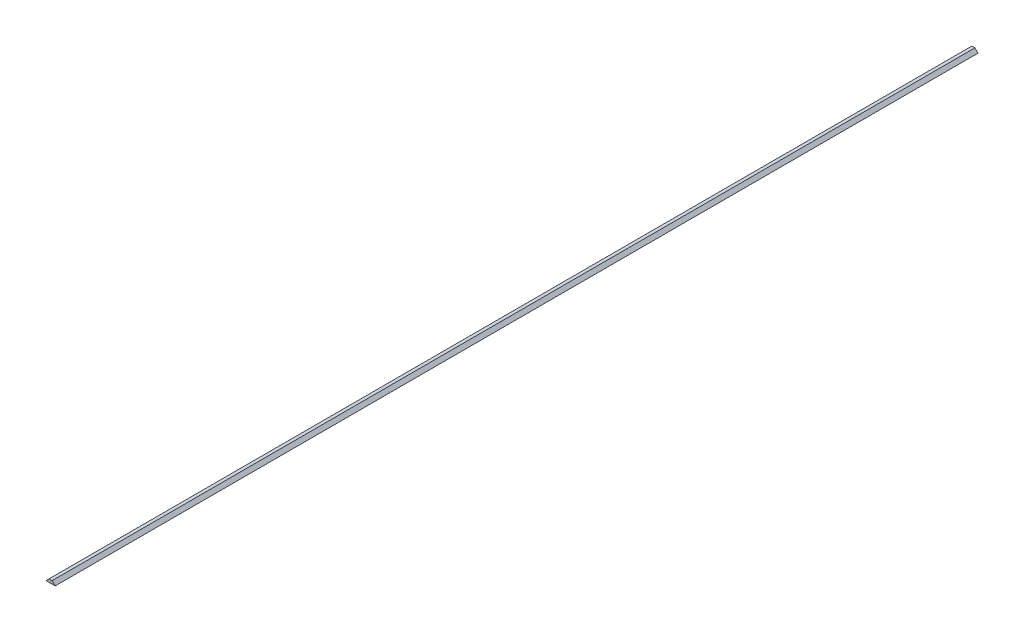
ISO-10303-21;
HEADER;
FILE_DESCRIPTION(('STEP AP214'),'2;1');
FILE_NAME('part.step','',(''),(''),'','','');
FILE_SCHEMA(('AUTOMOTIVE_DESIGN { 1 0 10303 214 1 1 1 1 }'));
ENDSEC;
DATA;
#1=APPLICATION_CONTEXT('core data for automotive mechanical design processes');
#2=APPLICATION_PROTOCOL_DEFINITION('international standard','automotive_design',2000,#1);
#3=PRODUCT_CONTEXT('',#1,'mechanical');
#4=PRODUCT('Part','Part','',(#3));
#5=PRODUCT_RELATED_PRODUCT_CATEGORY('part','',(#4));
#6=PRODUCT_DEFINITION_FORMATION('','',#4);
#7=PRODUCT_DEFINITION_CONTEXT('part definition',#1,'design');
#8=PRODUCT_DEFINITION('design','',#6,#7);
#9=PRODUCT_DEFINITION_SHAPE('','',#8);
#10=(LENGTH_UNIT() NAMED_UNIT(*) SI_UNIT(.MILLI.,.METRE.));
#11=(NAMED_UNIT(*) PLANE_ANGLE_UNIT() SI_UNIT($,.RADIAN.));
#12=(NAMED_UNIT(*) SI_UNIT($,.STERADIAN.) SOLID_ANGLE_UNIT());
#13=UNCERTAINTY_MEASURE_WITH_UNIT(LENGTH_MEASURE(1.E-05),#10,'distance_accuracy_value','');
#14=(GEOMETRIC_REPRESENTATION_CONTEXT(3) GLOBAL_UNCERTAINTY_ASSIGNED_CONTEXT((#13)) GLOBAL_UNIT_ASSIGNED_CONTEXT((#10,
#11,#12)) REPRESENTATION_CONTEXT('',''));
#15=CARTESIAN_POINT('',(0.,0.,0.));
#16=DIRECTION('',(0.,0.,1.));
#17=DIRECTION('',(1.,0.,0.));
#18=AXIS2_PLACEMENT_3D('',#15,#16,#17);
#19=CARTESIAN_POINT('',(5.,10.,3000.));
#20=DIRECTION('',(0.,-1.,0.));
#21=DIRECTION('',(0.,0.,-1.));
#22=AXIS2_PLACEMENT_3D('',#19,#20,#21);
#23=PLANE('',#22);
#24=DIRECTION('',(-1.,0.,0.));
#25=VECTOR('',#24,1.);
#26=CARTESIAN_POINT('',(5.,10.,0.));
#27=LINE('',#26,#25);
#28=CARTESIAN_POINT('',(5.,10.,0.));
#29=VERTEX_POINT('',#28);
#30=CARTESIAN_POINT('',(-5.,10.,0.));
#31=VERTEX_POINT('',#30);
#32=EDGE_CURVE('E97',#29,#31,#27,.T.);
#33=ORIENTED_EDGE('',*,*,#32,.T.);
#34=DIRECTION('',(0.,0.,-1.));
#35=VECTOR('',#34,1.);
#36=CARTESIAN_POINT('',(-5.,10.,3000.));
#37=LINE('',#36,#35);
#38=CARTESIAN_POINT('',(-5.,10.,3000.));
#39=VERTEX_POINT('',#38);
#40=EDGE_CURVE('E11',#39,#31,#37,.T.);
#41=ORIENTED_EDGE('',*,*,#40,.F.);
#42=DIRECTION('',(-1.,0.,0.));
#43=VECTOR('',#42,1.);
#44=CARTESIAN_POINT('',(5.,10.,3000.));
#45=LINE('',#44,#43);
#46=CARTESIAN_POINT('',(5.,10.,3000.));
#47=VERTEX_POINT('',#46);
#48=EDGE_CURVE('E85',#47,#39,#45,.T.);
#49=ORIENTED_EDGE('',*,*,#48,.F.);
#50=DIRECTION('',(0.,0.,-1.));
#51=VECTOR('',#50,1.);
#52=CARTESIAN_POINT('',(5.,10.,3000.));
#53=LINE('',#52,#51);
#54=EDGE_CURVE('E93',#47,#29,#53,.T.);
#55=ORIENTED_EDGE('',*,*,#54,.T.);
#56=EDGE_LOOP('',(#33,#41,#49,#55));
#57=FACE_BOUND('',#56,.T.);
#58=ADVANCED_FACE('F34',(#57),#23,.F.);
#59=CARTESIAN_POINT('',(-5.,10.,3000.));
#60=DIRECTION('',(0.707106781186549,-0.707106781186546,0.));
#61=DIRECTION('',(0.707106781186546,0.707106781186549,0.));
#62=AXIS2_PLACEMENT_3D('',#59,#60,#61);
#63=PLANE('',#62);
#64=DIRECTION('',(-0.707106781186546,-0.707106781186549,0.));
#65=VECTOR('',#64,1.);
#66=CARTESIAN_POINT('',(-5.,10.,0.));
#67=LINE('',#66,#65);
#68=CARTESIAN_POINT('',(-15.,0.,0.));
#69=VERTEX_POINT('',#68);
#70=EDGE_CURVE('E89',#31,#69,#67,.T.);
#71=ORIENTED_EDGE('',*,*,#70,.T.);
#72=DIRECTION('',(0.,0.,-1.));
#73=VECTOR('',#72,1.);
#74=CARTESIAN_POINT('',(-15.,0.,3000.));
#75=LINE('',#74,#73);
#76=CARTESIAN_POINT('',(-15.,0.,3000.));
#77=VERTEX_POINT('',#76);
#78=EDGE_CURVE('E42',#77,#69,#75,.T.);
#79=ORIENTED_EDGE('',*,*,#78,.F.);
#80=DIRECTION('',(-0.707106781186546,-0.707106781186549,0.));
#81=VECTOR('',#80,1.);
#82=CARTESIAN_POINT('',(-5.,10.,3000.));
#83=LINE('',#82,#81);
#84=EDGE_CURVE('E80',#39,#77,#83,.T.);
#85=ORIENTED_EDGE('',*,*,#84,.F.);
#86=ORIENTED_EDGE('',*,*,#40,.T.);
#87=EDGE_LOOP('',(#71,#79,#85,#86));
#88=FACE_BOUND('',#87,.T.);
#89=ADVANCED_FACE('F88',(#88),#63,.F.);
#90=CARTESIAN_POINT('',(-15.,0.,3000.));
#91=DIRECTION('',(0.,1.,0.));
#92=DIRECTION('',(0.,0.,1.));
#93=AXIS2_PLACEMENT_3D('',#90,#91,#92);
#94=PLANE('',#93);
#95=DIRECTION('',(1.,0.,0.));
#96=VECTOR('',#95,1.);
#97=CARTESIAN_POINT('',(-15.,0.,0.));
#98=LINE('',#97,#96);
#99=CARTESIAN_POINT('',(15.,0.,0.));
#100=VERTEX_POINT('',#99);
#101=EDGE_CURVE('E67',#69,#100,#98,.T.);
#102=ORIENTED_EDGE('',*,*,#101,.T.);
#103=DIRECTION('',(0.,0.,-1.));
#104=VECTOR('',#103,1.);
#105=CARTESIAN_POINT('',(15.,0.,3000.));
#106=LINE('',#105,#104);
#107=CARTESIAN_POINT('',(15.,0.,3000.));
#108=VERTEX_POINT('',#107);
#109=EDGE_CURVE('E90',#108,#100,#106,.T.);
#110=ORIENTED_EDGE('',*,*,#109,.F.);
#111=DIRECTION('',(1.,0.,0.));
#112=VECTOR('',#111,1.);
#113=CARTESIAN_POINT('',(-15.,0.,3000.));
#114=LINE('',#113,#112);
#115=EDGE_CURVE('E83',#77,#108,#114,.T.);
#116=ORIENTED_EDGE('',*,*,#115,.F.);
#117=ORIENTED_EDGE('',*,*,#78,.T.);
#118=EDGE_LOOP('',(#102,#110,#116,#117));
#119=FACE_BOUND('',#118,.T.);
#120=ADVANCED_FACE('F91',(#119),#94,.F.);
#121=CARTESIAN_POINT('',(15.,0.,3000.));
#122=DIRECTION('',(-0.707106781186549,-0.707106781186546,0.));
#123=DIRECTION('',(0.707106781186546,-0.707106781186549,0.));
#124=AXIS2_PLACEMENT_3D('',#121,#122,#123);
#125=PLANE('',#124);
#126=DIRECTION('',(-0.707106781186546,0.707106781186549,0.));
#127=VECTOR('',#126,1.);
#128=CARTESIAN_POINT('',(15.,0.,0.));
#129=LINE('',#128,#127);
#130=EDGE_CURVE('E73',#100,#29,#129,.T.);
#131=ORIENTED_EDGE('',*,*,#130,.T.);
#132=ORIENTED_EDGE('',*,*,#54,.F.);
#133=DIRECTION('',(-0.707106781186546,0.707106781186549,0.));
#134=VECTOR('',#133,1.);
#135=CARTESIAN_POINT('',(15.,0.,3000.));
#136=LINE('',#135,#134);
#137=EDGE_CURVE('E50',#108,#47,#136,.T.);
#138=ORIENTED_EDGE('',*,*,#137,.F.);
#139=ORIENTED_EDGE('',*,*,#109,.T.);
#140=EDGE_LOOP('',(#131,#132,#138,#139));
#141=FACE_BOUND('',#140,.T.);
#142=ADVANCED_FACE('F104',(#141),#125,.F.);
#143=CARTESIAN_POINT('',(0.,0.,3000.));
#144=DIRECTION('',(0.,0.,1.));
#145=DIRECTION('',(1.,0.,0.));
#146=AXIS2_PLACEMENT_3D('',#143,#144,#145);
#147=PLANE('',#146);
#148=ORIENTED_EDGE('',*,*,#48,.T.);
#149=ORIENTED_EDGE('',*,*,#84,.T.);
#150=ORIENTED_EDGE('',*,*,#115,.T.);
#151=ORIENTED_EDGE('',*,*,#137,.T.);
#152=EDGE_LOOP('',(#148,#149,#150,#151));
#153=FACE_BOUND('',#152,.T.);
#154=ADVANCED_FACE('F81',(#153),#147,.T.);
#155=CARTESIAN_POINT('',(0.,0.,0.));
#156=DIRECTION('',(0.,0.,1.));
#157=DIRECTION('',(1.,0.,0.));
#158=AXIS2_PLACEMENT_3D('',#155,#156,#157);
#159=PLANE('',#158);
#160=ORIENTED_EDGE('',*,*,#32,.F.);
#161=ORIENTED_EDGE('',*,*,#130,.F.);
#162=ORIENTED_EDGE('',*,*,#101,.F.);
#163=ORIENTED_EDGE('',*,*,#70,.F.);
#164=EDGE_LOOP('',(#160,#161,#162,#163));
#165=FACE_BOUND('',#164,.T.);
#166=ADVANCED_FACE('F107',(#165),#159,.F.);
#167=CLOSED_SHELL('',(#58,#89,#120,#142,#154,#166));
#168=MANIFOLD_SOLID_BREP('B2',#167);
#169=ADVANCED_BREP_SHAPE_REPRESENTATION('',(#18,#168),#14);
#170=SHAPE_DEFINITION_REPRESENTATION(#9,#169);
ENDSEC;
END-ISO-10303-21;
